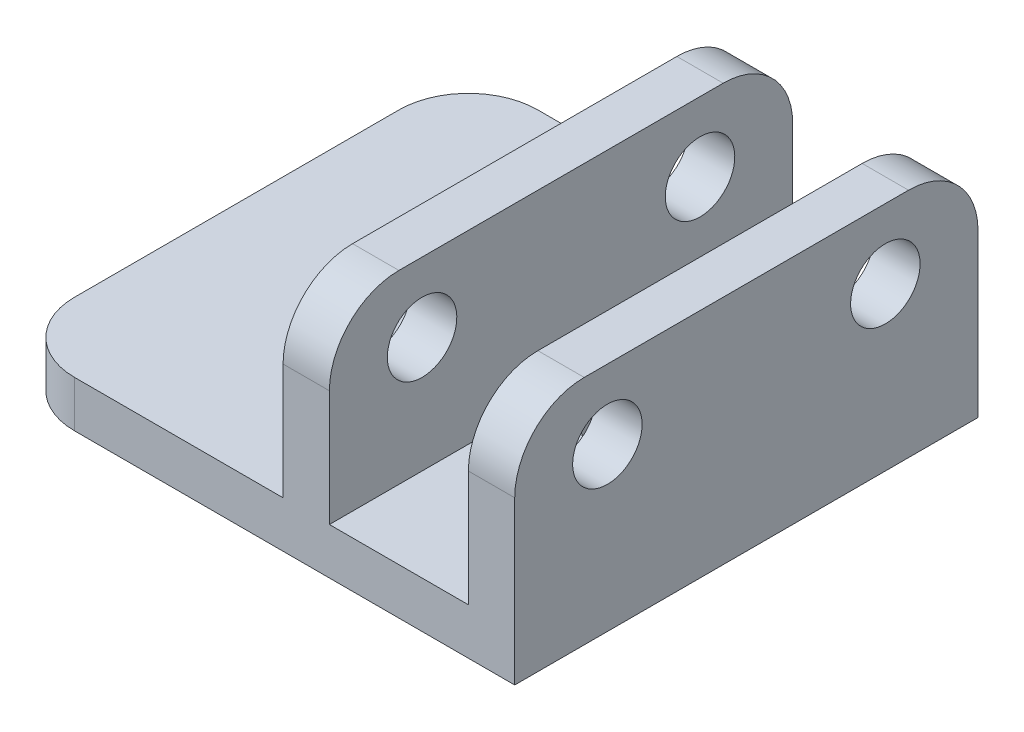
ISO-10303-21;
HEADER;
FILE_DESCRIPTION(('STEP AP214'),'2;1');
FILE_NAME('part.step','',(''),(''),'','','');
FILE_SCHEMA(('AUTOMOTIVE_DESIGN { 1 0 10303 214 1 1 1 1 }'));
ENDSEC;
DATA;
#1=APPLICATION_CONTEXT('core data for automotive mechanical design processes');
#2=APPLICATION_PROTOCOL_DEFINITION('international standard','automotive_design',2000,#1);
#3=PRODUCT_CONTEXT('',#1,'mechanical');
#4=PRODUCT('Part','Part','',(#3));
#5=PRODUCT_RELATED_PRODUCT_CATEGORY('part','',(#4));
#6=PRODUCT_DEFINITION_FORMATION('','',#4);
#7=PRODUCT_DEFINITION_CONTEXT('part definition',#1,'design');
#8=PRODUCT_DEFINITION('design','',#6,#7);
#9=PRODUCT_DEFINITION_SHAPE('','',#8);
#10=(LENGTH_UNIT() NAMED_UNIT(*) SI_UNIT(.MILLI.,.METRE.));
#11=(NAMED_UNIT(*) PLANE_ANGLE_UNIT() SI_UNIT($,.RADIAN.));
#12=(NAMED_UNIT(*) SI_UNIT($,.STERADIAN.) SOLID_ANGLE_UNIT());
#13=UNCERTAINTY_MEASURE_WITH_UNIT(LENGTH_MEASURE(1.E-05),#10,'distance_accuracy_value','');
#14=(GEOMETRIC_REPRESENTATION_CONTEXT(3) GLOBAL_UNCERTAINTY_ASSIGNED_CONTEXT((#13)) GLOBAL_UNIT_ASSIGNED_CONTEXT((#10,
#11,#12)) REPRESENTATION_CONTEXT('',''));
#15=CARTESIAN_POINT('',(0.,0.,0.));
#16=DIRECTION('',(0.,0.,1.));
#17=DIRECTION('',(1.,0.,0.));
#18=AXIS2_PLACEMENT_3D('',#15,#16,#17);
#19=CARTESIAN_POINT('',(3.,10.,20.));
#20=DIRECTION('',(1.,0.,0.));
#21=DIRECTION('',(0.,1.,0.));
#22=AXIS2_PLACEMENT_3D('',#19,#20,#21);
#23=PLANE('',#22);
#24=CARTESIAN_POINT('',(3.,7.,16.));
#25=DIRECTION('',(1.,0.,0.));
#26=DIRECTION('',(0.,1.,0.));
#27=AXIS2_PLACEMENT_3D('',#24,#25,#26);
#28=CIRCLE('',#27,1.5);
#29=CARTESIAN_POINT('',(3.,8.5,16.));
#30=VERTEX_POINT('',#29);
#31=EDGE_CURVE('E275',#30,#30,#28,.T.);
#32=ORIENTED_EDGE('',*,*,#31,.T.);
#33=EDGE_LOOP('',(#32));
#34=FACE_BOUND('',#33,.T.);
#35=CARTESIAN_POINT('',(3.,7.,4.));
#36=DIRECTION('',(1.,0.,0.));
#37=DIRECTION('',(0.,1.,0.));
#38=AXIS2_PLACEMENT_3D('',#35,#36,#37);
#39=CIRCLE('',#38,1.5);
#40=CARTESIAN_POINT('',(3.,8.5,4.));
#41=VERTEX_POINT('',#40);
#42=EDGE_CURVE('E269',#41,#41,#39,.T.);
#43=ORIENTED_EDGE('',*,*,#42,.T.);
#44=EDGE_LOOP('',(#43));
#45=FACE_BOUND('',#44,.T.);
#46=DIRECTION('',(0.,0.,-1.));
#47=VECTOR('',#46,1.);
#48=CARTESIAN_POINT('',(3.,10.,20.));
#49=LINE('',#48,#47);
#50=CARTESIAN_POINT('',(3.,10.,17.));
#51=VERTEX_POINT('',#50);
#52=CARTESIAN_POINT('',(3.,10.,3.));
#53=VERTEX_POINT('',#52);
#54=EDGE_CURVE('E303',#51,#53,#49,.T.);
#55=ORIENTED_EDGE('',*,*,#54,.T.);
#56=CARTESIAN_POINT('',(3.,7.,3.));
#57=DIRECTION('',(1.,0.,0.));
#58=DIRECTION('',(0.,1.,0.));
#59=AXIS2_PLACEMENT_3D('',#56,#57,#58);
#60=CIRCLE('',#59,3.);
#61=CARTESIAN_POINT('',(3.,7.,0.));
#62=VERTEX_POINT('',#61);
#63=EDGE_CURVE('E228',#53,#62,#60,.F.);
#64=ORIENTED_EDGE('',*,*,#63,.T.);
#65=DIRECTION('',(0.,-1.,0.));
#66=VECTOR('',#65,1.);
#67=CARTESIAN_POINT('',(3.,10.,0.));
#68=LINE('',#67,#66);
#69=CARTESIAN_POINT('',(3.,2.,0.));
#70=VERTEX_POINT('',#69);
#71=EDGE_CURVE('E181',#62,#70,#68,.T.);
#72=ORIENTED_EDGE('',*,*,#71,.T.);
#73=DIRECTION('',(0.,0.,-1.));
#74=VECTOR('',#73,1.);
#75=CARTESIAN_POINT('',(3.,2.,20.));
#76=LINE('',#75,#74);
#77=CARTESIAN_POINT('',(3.,2.,20.));
#78=VERTEX_POINT('',#77);
#79=EDGE_CURVE('E172',#78,#70,#76,.T.);
#80=ORIENTED_EDGE('',*,*,#79,.F.);
#81=DIRECTION('',(0.,-1.,0.));
#82=VECTOR('',#81,1.);
#83=CARTESIAN_POINT('',(3.,10.,20.));
#84=LINE('',#83,#82);
#85=CARTESIAN_POINT('',(3.,7.,20.));
#86=VERTEX_POINT('',#85);
#87=EDGE_CURVE('E156',#86,#78,#84,.T.);
#88=ORIENTED_EDGE('',*,*,#87,.F.);
#89=CARTESIAN_POINT('',(3.,7.,17.));
#90=DIRECTION('',(1.,0.,0.));
#91=DIRECTION('',(0.,1.,0.));
#92=AXIS2_PLACEMENT_3D('',#89,#90,#91);
#93=CIRCLE('',#92,3.);
#94=EDGE_CURVE('E225',#86,#51,#93,.F.);
#95=ORIENTED_EDGE('',*,*,#94,.T.);
#96=EDGE_LOOP('',(#55,#64,#72,#80,#88,#95));
#97=FACE_BOUND('',#96,.T.);
#98=ADVANCED_FACE('F38',(#34,#45,#97),#23,.F.);
#99=CARTESIAN_POINT('',(-3.,2.,20.));
#100=DIRECTION('',(0.,-1.,0.));
#101=DIRECTION('',(0.,0.,-1.));
#102=AXIS2_PLACEMENT_3D('',#99,#100,#101);
#103=PLANE('',#102);
#104=CARTESIAN_POINT('',(0.,2.,10.));
#105=DIRECTION('',(0.,1.,0.));
#106=DIRECTION('',(-1.,0.,0.));
#107=AXIS2_PLACEMENT_3D('',#104,#105,#106);
#108=CIRCLE('',#107,1.5);
#109=CARTESIAN_POINT('',(-1.5,2.,10.));
#110=VERTEX_POINT('',#109);
#111=EDGE_CURVE('E614',#110,#110,#108,.T.);
#112=ORIENTED_EDGE('',*,*,#111,.F.);
#113=EDGE_LOOP('',(#112));
#114=FACE_BOUND('',#113,.T.);
#115=DIRECTION('',(-1.,0.,0.));
#116=VECTOR('',#115,1.);
#117=CARTESIAN_POINT('',(-3.,2.,0.));
#118=LINE('',#117,#116);
#119=CARTESIAN_POINT('',(-3.,2.,0.));
#120=VERTEX_POINT('',#119);
#121=EDGE_CURVE('E306',#70,#120,#118,.T.);
#122=ORIENTED_EDGE('',*,*,#121,.T.);
#123=DIRECTION('',(0.,0.,-1.));
#124=VECTOR('',#123,1.);
#125=CARTESIAN_POINT('',(-3.,2.,20.));
#126=LINE('',#125,#124);
#127=CARTESIAN_POINT('',(-3.,2.,20.));
#128=VERTEX_POINT('',#127);
#129=EDGE_CURVE('E174',#128,#120,#126,.T.);
#130=ORIENTED_EDGE('',*,*,#129,.F.);
#131=DIRECTION('',(-1.,0.,0.));
#132=VECTOR('',#131,1.);
#133=CARTESIAN_POINT('',(-3.,2.,20.));
#134=LINE('',#133,#132);
#135=EDGE_CURVE('E160',#78,#128,#134,.T.);
#136=ORIENTED_EDGE('',*,*,#135,.F.);
#137=ORIENTED_EDGE('',*,*,#79,.T.);
#138=EDGE_LOOP('',(#122,#130,#136,#137));
#139=FACE_BOUND('',#138,.T.);
#140=ADVANCED_FACE('F171',(#114,#139),#103,.F.);
#141=CARTESIAN_POINT('',(-3.,10.,20.));
#142=DIRECTION('',(-1.,0.,0.));
#143=DIRECTION('',(0.,-1.,0.));
#144=AXIS2_PLACEMENT_3D('',#141,#142,#143);
#145=PLANE('',#144);
#146=CARTESIAN_POINT('',(-3.,7.,16.));
#147=DIRECTION('',(-1.,0.,0.));
#148=DIRECTION('',(0.,-1.,0.));
#149=AXIS2_PLACEMENT_3D('',#146,#147,#148);
#150=CIRCLE('',#149,1.5);
#151=CARTESIAN_POINT('',(-3.,5.5,16.));
#152=VERTEX_POINT('',#151);
#153=EDGE_CURVE('E268',#152,#152,#150,.T.);
#154=ORIENTED_EDGE('',*,*,#153,.T.);
#155=EDGE_LOOP('',(#154));
#156=FACE_BOUND('',#155,.T.);
#157=CARTESIAN_POINT('',(-3.,7.,4.));
#158=DIRECTION('',(-1.,0.,0.));
#159=DIRECTION('',(0.,-1.,0.));
#160=AXIS2_PLACEMENT_3D('',#157,#158,#159);
#161=CIRCLE('',#160,1.5);
#162=CARTESIAN_POINT('',(-3.,5.5,4.));
#163=VERTEX_POINT('',#162);
#164=EDGE_CURVE('E263',#163,#163,#161,.T.);
#165=ORIENTED_EDGE('',*,*,#164,.T.);
#166=EDGE_LOOP('',(#165));
#167=FACE_BOUND('',#166,.T.);
#168=DIRECTION('',(0.,1.,0.));
#169=VECTOR('',#168,1.);
#170=CARTESIAN_POINT('',(-3.,10.,0.));
#171=LINE('',#170,#169);
#172=CARTESIAN_POINT('',(-3.,7.,0.));
#173=VERTEX_POINT('',#172);
#174=EDGE_CURVE('E309',#120,#173,#171,.T.);
#175=ORIENTED_EDGE('',*,*,#174,.T.);
#176=CARTESIAN_POINT('',(-3.,7.,3.));
#177=DIRECTION('',(-1.,0.,0.));
#178=DIRECTION('',(0.,-1.,0.));
#179=AXIS2_PLACEMENT_3D('',#176,#177,#178);
#180=CIRCLE('',#179,3.);
#181=CARTESIAN_POINT('',(-3.,10.,3.));
#182=VERTEX_POINT('',#181);
#183=EDGE_CURVE('E215',#173,#182,#180,.F.);
#184=ORIENTED_EDGE('',*,*,#183,.T.);
#185=DIRECTION('',(0.,0.,-1.));
#186=VECTOR('',#185,1.);
#187=CARTESIAN_POINT('',(-3.,10.,20.));
#188=LINE('',#187,#186);
#189=CARTESIAN_POINT('',(-3.,10.,17.));
#190=VERTEX_POINT('',#189);
#191=EDGE_CURVE('E190',#190,#182,#188,.T.);
#192=ORIENTED_EDGE('',*,*,#191,.F.);
#193=CARTESIAN_POINT('',(-3.,7.,17.));
#194=DIRECTION('',(-1.,0.,0.));
#195=DIRECTION('',(0.,-1.,0.));
#196=AXIS2_PLACEMENT_3D('',#193,#194,#195);
#197=CIRCLE('',#196,3.);
#198=CARTESIAN_POINT('',(-3.,7.,20.));
#199=VERTEX_POINT('',#198);
#200=EDGE_CURVE('E212',#190,#199,#197,.F.);
#201=ORIENTED_EDGE('',*,*,#200,.T.);
#202=DIRECTION('',(0.,1.,0.));
#203=VECTOR('',#202,1.);
#204=CARTESIAN_POINT('',(-3.,10.,20.));
#205=LINE('',#204,#203);
#206=EDGE_CURVE('E177',#128,#199,#205,.T.);
#207=ORIENTED_EDGE('',*,*,#206,.F.);
#208=ORIENTED_EDGE('',*,*,#129,.T.);
#209=EDGE_LOOP('',(#175,#184,#192,#201,#207,#208));
#210=FACE_BOUND('',#209,.T.);
#211=ADVANCED_FACE('F407',(#156,#167,#210),#145,.F.);
#212=CARTESIAN_POINT('',(-5.,10.,20.));
#213=DIRECTION('',(0.,-1.,0.));
#214=DIRECTION('',(0.,0.,-1.));
#215=AXIS2_PLACEMENT_3D('',#212,#213,#214);
#216=PLANE('',#215);
#217=ORIENTED_EDGE('',*,*,#191,.T.);
#218=DIRECTION('',(-1.,0.,0.));
#219=VECTOR('',#218,1.);
#220=CARTESIAN_POINT('',(-5.,10.,3.));
#221=LINE('',#220,#219);
#222=CARTESIAN_POINT('',(-5.,10.,3.));
#223=VERTEX_POINT('',#222);
#224=EDGE_CURVE('E188',#182,#223,#221,.T.);
#225=ORIENTED_EDGE('',*,*,#224,.T.);
#226=DIRECTION('',(0.,0.,-1.));
#227=VECTOR('',#226,1.);
#228=CARTESIAN_POINT('',(-5.,10.,20.));
#229=LINE('',#228,#227);
#230=CARTESIAN_POINT('',(-5.,10.,17.));
#231=VERTEX_POINT('',#230);
#232=EDGE_CURVE('E348',#231,#223,#229,.T.);
#233=ORIENTED_EDGE('',*,*,#232,.F.);
#234=DIRECTION('',(-1.,0.,0.));
#235=VECTOR('',#234,1.);
#236=CARTESIAN_POINT('',(-3.,10.,17.));
#237=LINE('',#236,#235);
#238=EDGE_CURVE('E184',#231,#190,#237,.F.);
#239=ORIENTED_EDGE('',*,*,#238,.T.);
#240=EDGE_LOOP('',(#217,#225,#233,#239));
#241=FACE_BOUND('',#240,.T.);
#242=ADVANCED_FACE('F356',(#241),#216,.F.);
#243=CARTESIAN_POINT('',(-5.,2.,20.));
#244=DIRECTION('',(1.,0.,0.));
#245=DIRECTION('',(0.,0.,-1.));
#246=AXIS2_PLACEMENT_3D('',#243,#244,#245);
#247=PLANE('',#246);
#248=CARTESIAN_POINT('',(-5.,7.,16.));
#249=DIRECTION('',(-1.,0.,0.));
#250=DIRECTION('',(0.,0.,1.));
#251=AXIS2_PLACEMENT_3D('',#248,#249,#250);
#252=CIRCLE('',#251,1.5);
#253=CARTESIAN_POINT('',(-5.,7.,17.5));
#254=VERTEX_POINT('',#253);
#255=EDGE_CURVE('E264',#254,#254,#252,.T.);
#256=ORIENTED_EDGE('',*,*,#255,.F.);
#257=EDGE_LOOP('',(#256));
#258=FACE_BOUND('',#257,.T.);
#259=CARTESIAN_POINT('',(-5.,7.,4.));
#260=DIRECTION('',(-1.,0.,0.));
#261=DIRECTION('',(0.,0.,-1.));
#262=AXIS2_PLACEMENT_3D('',#259,#260,#261);
#263=CIRCLE('',#262,1.5);
#264=CARTESIAN_POINT('',(-5.,7.,2.5));
#265=VERTEX_POINT('',#264);
#266=EDGE_CURVE('E460',#265,#265,#263,.T.);
#267=ORIENTED_EDGE('',*,*,#266,.F.);
#268=EDGE_LOOP('',(#267));
#269=FACE_BOUND('',#268,.T.);
#270=ORIENTED_EDGE('',*,*,#232,.T.);
#271=CARTESIAN_POINT('',(-5.,7.,3.));
#272=DIRECTION('',(1.,0.,0.));
#273=DIRECTION('',(0.,0.,-1.));
#274=AXIS2_PLACEMENT_3D('',#271,#272,#273);
#275=CIRCLE('',#274,3.);
#276=CARTESIAN_POINT('',(-5.,7.,0.));
#277=VERTEX_POINT('',#276);
#278=EDGE_CURVE('E200',#223,#277,#275,.F.);
#279=ORIENTED_EDGE('',*,*,#278,.T.);
#280=DIRECTION('',(0.,-1.,0.));
#281=VECTOR('',#280,1.);
#282=CARTESIAN_POINT('',(-5.,2.,0.));
#283=LINE('',#282,#281);
#284=CARTESIAN_POINT('',(-5.,2.,0.));
#285=VERTEX_POINT('',#284);
#286=EDGE_CURVE('E313',#277,#285,#283,.T.);
#287=ORIENTED_EDGE('',*,*,#286,.T.);
#288=DIRECTION('',(0.,0.,-1.));
#289=VECTOR('',#288,1.);
#290=CARTESIAN_POINT('',(-5.,2.,20.));
#291=LINE('',#290,#289);
#292=CARTESIAN_POINT('',(-5.,2.,20.));
#293=VERTEX_POINT('',#292);
#294=EDGE_CURVE('E344',#293,#285,#291,.T.);
#295=ORIENTED_EDGE('',*,*,#294,.F.);
#296=DIRECTION('',(0.,-1.,0.));
#297=VECTOR('',#296,1.);
#298=CARTESIAN_POINT('',(-5.,2.,20.));
#299=LINE('',#298,#297);
#300=CARTESIAN_POINT('',(-5.,7.,20.));
#301=VERTEX_POINT('',#300);
#302=EDGE_CURVE('E291',#301,#293,#299,.T.);
#303=ORIENTED_EDGE('',*,*,#302,.F.);
#304=CARTESIAN_POINT('',(-5.,7.,17.));
#305=DIRECTION('',(1.,0.,0.));
#306=DIRECTION('',(0.,0.,-1.));
#307=AXIS2_PLACEMENT_3D('',#304,#305,#306);
#308=CIRCLE('',#307,3.);
#309=EDGE_CURVE('E197',#301,#231,#308,.F.);
#310=ORIENTED_EDGE('',*,*,#309,.T.);
#311=EDGE_LOOP('',(#270,#279,#287,#295,#303,#310));
#312=FACE_BOUND('',#311,.T.);
#313=ADVANCED_FACE('F367',(#258,#269,#312),#247,.F.);
#314=CARTESIAN_POINT('',(-17.,2.,20.));
#315=DIRECTION('',(0.,-1.,0.));
#316=DIRECTION('',(1.,0.,0.));
#317=AXIS2_PLACEMENT_3D('',#314,#315,#316);
#318=PLANE('',#317);
#319=DIRECTION('',(-1.,0.,0.));
#320=VECTOR('',#319,1.);
#321=CARTESIAN_POINT('',(-17.,2.,0.));
#322=LINE('',#321,#320);
#323=CARTESIAN_POINT('',(-14.,2.,0.));
#324=VERTEX_POINT('',#323);
#325=EDGE_CURVE('E316',#285,#324,#322,.T.);
#326=ORIENTED_EDGE('',*,*,#325,.T.);
#327=CARTESIAN_POINT('',(-14.,2.,3.));
#328=DIRECTION('',(0.,-1.,0.));
#329=DIRECTION('',(1.,0.,0.));
#330=AXIS2_PLACEMENT_3D('',#327,#328,#329);
#331=CIRCLE('',#330,3.);
#332=CARTESIAN_POINT('',(-17.,2.,3.));
#333=VERTEX_POINT('',#332);
#334=EDGE_CURVE('E251',#324,#333,#331,.F.);
#335=ORIENTED_EDGE('',*,*,#334,.T.);
#336=DIRECTION('',(0.,0.,-1.));
#337=VECTOR('',#336,1.);
#338=CARTESIAN_POINT('',(-17.,2.,20.));
#339=LINE('',#338,#337);
#340=CARTESIAN_POINT('',(-17.,2.,17.));
#341=VERTEX_POINT('',#340);
#342=EDGE_CURVE('E340',#341,#333,#339,.T.);
#343=ORIENTED_EDGE('',*,*,#342,.F.);
#344=CARTESIAN_POINT('',(-14.,2.,17.));
#345=DIRECTION('',(0.,-1.,0.));
#346=DIRECTION('',(1.,0.,0.));
#347=AXIS2_PLACEMENT_3D('',#344,#345,#346);
#348=CIRCLE('',#347,3.);
#349=CARTESIAN_POINT('',(-14.,2.,20.));
#350=VERTEX_POINT('',#349);
#351=EDGE_CURVE('E56',#341,#350,#348,.F.);
#352=ORIENTED_EDGE('',*,*,#351,.T.);
#353=DIRECTION('',(-1.,0.,0.));
#354=VECTOR('',#353,1.);
#355=CARTESIAN_POINT('',(-17.,2.,20.));
#356=LINE('',#355,#354);
#357=EDGE_CURVE('E294',#293,#350,#356,.T.);
#358=ORIENTED_EDGE('',*,*,#357,.F.);
#359=ORIENTED_EDGE('',*,*,#294,.T.);
#360=EDGE_LOOP('',(#326,#335,#343,#352,#358,#359));
#361=FACE_BOUND('',#360,.T.);
#362=ADVANCED_FACE('F376',(#361),#318,.F.);
#363=CARTESIAN_POINT('',(-17.,0.,20.));
#364=DIRECTION('',(1.,0.,0.));
#365=DIRECTION('',(0.,0.,-1.));
#366=AXIS2_PLACEMENT_3D('',#363,#364,#365);
#367=PLANE('',#366);
#368=ORIENTED_EDGE('',*,*,#342,.T.);
#369=DIRECTION('',(0.,-1.,0.));
#370=VECTOR('',#369,1.);
#371=CARTESIAN_POINT('',(-17.,0.,3.));
#372=LINE('',#371,#370);
#373=CARTESIAN_POINT('',(-17.,0.,3.));
#374=VERTEX_POINT('',#373);
#375=EDGE_CURVE('E240',#333,#374,#372,.T.);
#376=ORIENTED_EDGE('',*,*,#375,.T.);
#377=DIRECTION('',(0.,0.,-1.));
#378=VECTOR('',#377,1.);
#379=CARTESIAN_POINT('',(-17.,0.,20.));
#380=LINE('',#379,#378);
#381=CARTESIAN_POINT('',(-17.,0.,17.));
#382=VERTEX_POINT('',#381);
#383=EDGE_CURVE('E336',#382,#374,#380,.T.);
#384=ORIENTED_EDGE('',*,*,#383,.F.);
#385=DIRECTION('',(0.,-1.,0.));
#386=VECTOR('',#385,1.);
#387=CARTESIAN_POINT('',(-17.,2.,17.));
#388=LINE('',#387,#386);
#389=EDGE_CURVE('E237',#382,#341,#388,.F.);
#390=ORIENTED_EDGE('',*,*,#389,.T.);
#391=EDGE_LOOP('',(#368,#376,#384,#390));
#392=FACE_BOUND('',#391,.T.);
#393=ADVANCED_FACE('F382',(#392),#367,.F.);
#394=CARTESIAN_POINT('',(5.,0.,20.));
#395=DIRECTION('',(0.,1.,0.));
#396=DIRECTION('',(-1.,0.,0.));
#397=AXIS2_PLACEMENT_3D('',#394,#395,#396);
#398=PLANE('',#397);
#399=CARTESIAN_POINT('',(0.,0.,10.));
#400=DIRECTION('',(0.,1.,0.));
#401=DIRECTION('',(-1.,0.,0.));
#402=AXIS2_PLACEMENT_3D('',#399,#400,#401);
#403=CIRCLE('',#402,1.5);
#404=CARTESIAN_POINT('',(-1.5,0.,10.));
#405=VERTEX_POINT('',#404);
#406=EDGE_CURVE('E42',#405,#405,#403,.T.);
#407=ORIENTED_EDGE('',*,*,#406,.T.);
#408=EDGE_LOOP('',(#407));
#409=FACE_BOUND('',#408,.T.);
#410=ORIENTED_EDGE('',*,*,#383,.T.);
#411=CARTESIAN_POINT('',(-14.,0.,3.));
#412=DIRECTION('',(0.,1.,0.));
#413=DIRECTION('',(-1.,0.,0.));
#414=AXIS2_PLACEMENT_3D('',#411,#412,#413);
#415=CIRCLE('',#414,3.);
#416=CARTESIAN_POINT('',(-14.,0.,0.));
#417=VERTEX_POINT('',#416);
#418=EDGE_CURVE('E246',#374,#417,#415,.F.);
#419=ORIENTED_EDGE('',*,*,#418,.T.);
#420=DIRECTION('',(1.,0.,0.));
#421=VECTOR('',#420,1.);
#422=CARTESIAN_POINT('',(5.,0.,0.));
#423=LINE('',#422,#421);
#424=CARTESIAN_POINT('',(5.,0.,0.));
#425=VERTEX_POINT('',#424);
#426=EDGE_CURVE('E320',#417,#425,#423,.T.);
#427=ORIENTED_EDGE('',*,*,#426,.T.);
#428=DIRECTION('',(0.,0.,-1.));
#429=VECTOR('',#428,1.);
#430=CARTESIAN_POINT('',(5.,0.,20.));
#431=LINE('',#430,#429);
#432=CARTESIAN_POINT('',(5.,0.,20.));
#433=VERTEX_POINT('',#432);
#434=EDGE_CURVE('E332',#433,#425,#431,.T.);
#435=ORIENTED_EDGE('',*,*,#434,.F.);
#436=DIRECTION('',(1.,0.,0.));
#437=VECTOR('',#436,1.);
#438=CARTESIAN_POINT('',(5.,0.,20.));
#439=LINE('',#438,#437);
#440=CARTESIAN_POINT('',(-14.,0.,20.));
#441=VERTEX_POINT('',#440);
#442=EDGE_CURVE('E297',#441,#433,#439,.T.);
#443=ORIENTED_EDGE('',*,*,#442,.F.);
#444=CARTESIAN_POINT('',(-14.,0.,17.));
#445=DIRECTION('',(0.,1.,0.));
#446=DIRECTION('',(-1.,0.,0.));
#447=AXIS2_PLACEMENT_3D('',#444,#445,#446);
#448=CIRCLE('',#447,3.);
#449=EDGE_CURVE('E64',#441,#382,#448,.F.);
#450=ORIENTED_EDGE('',*,*,#449,.T.);
#451=EDGE_LOOP('',(#410,#419,#427,#435,#443,#450));
#452=FACE_BOUND('',#451,.T.);
#453=ADVANCED_FACE('F384',(#409,#452),#398,.F.);
#454=CARTESIAN_POINT('',(5.,10.,20.));
#455=DIRECTION('',(-1.,0.,0.));
#456=DIRECTION('',(0.,-1.,0.));
#457=AXIS2_PLACEMENT_3D('',#454,#455,#456);
#458=PLANE('',#457);
#459=CARTESIAN_POINT('',(5.,7.,16.));
#460=DIRECTION('',(-1.,0.,0.));
#461=DIRECTION('',(0.,-1.,0.));
#462=AXIS2_PLACEMENT_3D('',#459,#460,#461);
#463=CIRCLE('',#462,1.5);
#464=CARTESIAN_POINT('',(5.,5.5,16.));
#465=VERTEX_POINT('',#464);
#466=EDGE_CURVE('E265',#465,#465,#463,.T.);
#467=ORIENTED_EDGE('',*,*,#466,.T.);
#468=EDGE_LOOP('',(#467));
#469=FACE_BOUND('',#468,.T.);
#470=CARTESIAN_POINT('',(5.,7.,4.));
#471=DIRECTION('',(-1.,0.,0.));
#472=DIRECTION('',(0.,-1.,0.));
#473=AXIS2_PLACEMENT_3D('',#470,#471,#472);
#474=CIRCLE('',#473,1.5);
#475=CARTESIAN_POINT('',(5.,5.5,4.));
#476=VERTEX_POINT('',#475);
#477=EDGE_CURVE('E260',#476,#476,#474,.T.);
#478=ORIENTED_EDGE('',*,*,#477,.T.);
#479=EDGE_LOOP('',(#478));
#480=FACE_BOUND('',#479,.T.);
#481=DIRECTION('',(0.,1.,0.));
#482=VECTOR('',#481,1.);
#483=CARTESIAN_POINT('',(5.,10.,0.));
#484=LINE('',#483,#482);
#485=CARTESIAN_POINT('',(5.,7.,0.));
#486=VERTEX_POINT('',#485);
#487=EDGE_CURVE('E167',#425,#486,#484,.T.);
#488=ORIENTED_EDGE('',*,*,#487,.T.);
#489=CARTESIAN_POINT('',(5.,7.,3.));
#490=DIRECTION('',(-1.,0.,0.));
#491=DIRECTION('',(0.,-1.,0.));
#492=AXIS2_PLACEMENT_3D('',#489,#490,#491);
#493=CIRCLE('',#492,3.);
#494=CARTESIAN_POINT('',(5.,10.,3.));
#495=VERTEX_POINT('',#494);
#496=EDGE_CURVE('E234',#486,#495,#493,.F.);
#497=ORIENTED_EDGE('',*,*,#496,.T.);
#498=DIRECTION('',(0.,0.,-1.));
#499=VECTOR('',#498,1.);
#500=CARTESIAN_POINT('',(5.,10.,20.));
#501=LINE('',#500,#499);
#502=CARTESIAN_POINT('',(5.,10.,17.));
#503=VERTEX_POINT('',#502);
#504=EDGE_CURVE('E328',#503,#495,#501,.T.);
#505=ORIENTED_EDGE('',*,*,#504,.F.);
#506=CARTESIAN_POINT('',(5.,7.,17.));
#507=DIRECTION('',(-1.,0.,0.));
#508=DIRECTION('',(0.,-1.,0.));
#509=AXIS2_PLACEMENT_3D('',#506,#507,#508);
#510=CIRCLE('',#509,3.);
#511=CARTESIAN_POINT('',(5.,7.,20.));
#512=VERTEX_POINT('',#511);
#513=EDGE_CURVE('E231',#503,#512,#510,.F.);
#514=ORIENTED_EDGE('',*,*,#513,.T.);
#515=DIRECTION('',(0.,1.,0.));
#516=VECTOR('',#515,1.);
#517=CARTESIAN_POINT('',(5.,10.,20.));
#518=LINE('',#517,#516);
#519=EDGE_CURVE('E300',#433,#512,#518,.T.);
#520=ORIENTED_EDGE('',*,*,#519,.F.);
#521=ORIENTED_EDGE('',*,*,#434,.T.);
#522=EDGE_LOOP('',(#488,#497,#505,#514,#520,#521));
#523=FACE_BOUND('',#522,.T.);
#524=ADVANCED_FACE('F423',(#469,#480,#523),#458,.F.);
#525=CARTESIAN_POINT('',(5.,10.,20.));
#526=DIRECTION('',(0.,-1.,0.));
#527=DIRECTION('',(0.,0.,-1.));
#528=AXIS2_PLACEMENT_3D('',#525,#526,#527);
#529=PLANE('',#528);
#530=ORIENTED_EDGE('',*,*,#504,.T.);
#531=DIRECTION('',(-1.,0.,0.));
#532=VECTOR('',#531,1.);
#533=CARTESIAN_POINT('',(5.,10.,3.));
#534=LINE('',#533,#532);
#535=EDGE_CURVE('E221',#495,#53,#534,.T.);
#536=ORIENTED_EDGE('',*,*,#535,.T.);
#537=ORIENTED_EDGE('',*,*,#54,.F.);
#538=DIRECTION('',(-1.,0.,0.));
#539=VECTOR('',#538,1.);
#540=CARTESIAN_POINT('',(5.,10.,17.));
#541=LINE('',#540,#539);
#542=EDGE_CURVE('E218',#51,#503,#541,.F.);
#543=ORIENTED_EDGE('',*,*,#542,.T.);
#544=EDGE_LOOP('',(#530,#536,#537,#543));
#545=FACE_BOUND('',#544,.T.);
#546=ADVANCED_FACE('F427',(#545),#529,.F.);
#547=CARTESIAN_POINT('',(0.,0.,20.));
#548=DIRECTION('',(0.,0.,1.));
#549=DIRECTION('',(1.,0.,0.));
#550=AXIS2_PLACEMENT_3D('',#547,#548,#549);
#551=PLANE('',#550);
#552=ORIENTED_EDGE('',*,*,#357,.T.);
#553=DIRECTION('',(0.,-1.,0.));
#554=VECTOR('',#553,1.);
#555=CARTESIAN_POINT('',(-14.,0.,20.));
#556=LINE('',#555,#554);
#557=EDGE_CURVE('E11',#350,#441,#556,.T.);
#558=ORIENTED_EDGE('',*,*,#557,.T.);
#559=ORIENTED_EDGE('',*,*,#442,.T.);
#560=ORIENTED_EDGE('',*,*,#519,.T.);
#561=DIRECTION('',(-1.,0.,0.));
#562=VECTOR('',#561,1.);
#563=CARTESIAN_POINT('',(3.,7.,20.));
#564=LINE('',#563,#562);
#565=EDGE_CURVE('E48',#512,#86,#564,.T.);
#566=ORIENTED_EDGE('',*,*,#565,.T.);
#567=ORIENTED_EDGE('',*,*,#87,.T.);
#568=ORIENTED_EDGE('',*,*,#135,.T.);
#569=ORIENTED_EDGE('',*,*,#206,.T.);
#570=DIRECTION('',(-1.,0.,0.));
#571=VECTOR('',#570,1.);
#572=CARTESIAN_POINT('',(-5.,7.,20.));
#573=LINE('',#572,#571);
#574=EDGE_CURVE('E254',#199,#301,#573,.T.);
#575=ORIENTED_EDGE('',*,*,#574,.T.);
#576=ORIENTED_EDGE('',*,*,#302,.T.);
#577=EDGE_LOOP('',(#552,#558,#559,#560,#566,#567,#568,#569,#575,#576));
#578=FACE_BOUND('',#577,.T.);
#579=ADVANCED_FACE('F158',(#578),#551,.T.);
#580=CARTESIAN_POINT('',(0.,0.,0.));
#581=DIRECTION('',(0.,0.,1.));
#582=DIRECTION('',(1.,0.,0.));
#583=AXIS2_PLACEMENT_3D('',#580,#581,#582);
#584=PLANE('',#583);
#585=ORIENTED_EDGE('',*,*,#286,.F.);
#586=DIRECTION('',(-1.,0.,0.));
#587=VECTOR('',#586,1.);
#588=CARTESIAN_POINT('',(0.,7.,0.));
#589=LINE('',#588,#587);
#590=EDGE_CURVE('E209',#277,#173,#589,.F.);
#591=ORIENTED_EDGE('',*,*,#590,.T.);
#592=ORIENTED_EDGE('',*,*,#174,.F.);
#593=ORIENTED_EDGE('',*,*,#121,.F.);
#594=ORIENTED_EDGE('',*,*,#71,.F.);
#595=DIRECTION('',(-1.,0.,0.));
#596=VECTOR('',#595,1.);
#597=CARTESIAN_POINT('',(0.,7.,0.));
#598=LINE('',#597,#596);
#599=EDGE_CURVE('E206',#62,#486,#598,.F.);
#600=ORIENTED_EDGE('',*,*,#599,.T.);
#601=ORIENTED_EDGE('',*,*,#487,.F.);
#602=ORIENTED_EDGE('',*,*,#426,.F.);
#603=DIRECTION('',(0.,-1.,0.));
#604=VECTOR('',#603,1.);
#605=CARTESIAN_POINT('',(-14.,0.,0.));
#606=LINE('',#605,#604);
#607=EDGE_CURVE('E203',#417,#324,#606,.F.);
#608=ORIENTED_EDGE('',*,*,#607,.T.);
#609=ORIENTED_EDGE('',*,*,#325,.F.);
#610=EDGE_LOOP('',(#585,#591,#592,#593,#594,#600,#601,#602,#608,#609));
#611=FACE_BOUND('',#610,.T.);
#612=ADVANCED_FACE('F371',(#611),#584,.F.);
#613=CARTESIAN_POINT('',(-5.,7.,3.));
#614=DIRECTION('',(-1.,0.,0.));
#615=DIRECTION('',(0.,0.,1.));
#616=AXIS2_PLACEMENT_3D('',#613,#614,#615);
#617=CYLINDRICAL_SURFACE('',#616,3.);
#618=ORIENTED_EDGE('',*,*,#183,.F.);
#619=ORIENTED_EDGE('',*,*,#590,.F.);
#620=ORIENTED_EDGE('',*,*,#278,.F.);
#621=ORIENTED_EDGE('',*,*,#224,.F.);
#622=EDGE_LOOP('',(#618,#619,#620,#621));
#623=FACE_BOUND('',#622,.T.);
#624=ADVANCED_FACE('F363',(#623),#617,.T.);
#625=CARTESIAN_POINT('',(5.,7.,3.));
#626=DIRECTION('',(-1.,0.,0.));
#627=DIRECTION('',(0.,0.,1.));
#628=AXIS2_PLACEMENT_3D('',#625,#626,#627);
#629=CYLINDRICAL_SURFACE('',#628,3.);
#630=ORIENTED_EDGE('',*,*,#496,.F.);
#631=ORIENTED_EDGE('',*,*,#599,.F.);
#632=ORIENTED_EDGE('',*,*,#63,.F.);
#633=ORIENTED_EDGE('',*,*,#535,.F.);
#634=EDGE_LOOP('',(#630,#631,#632,#633));
#635=FACE_BOUND('',#634,.T.);
#636=ADVANCED_FACE('F397',(#635),#629,.T.);
#637=CARTESIAN_POINT('',(-14.,0.,3.));
#638=DIRECTION('',(0.,-1.,0.));
#639=DIRECTION('',(0.,0.,-1.));
#640=AXIS2_PLACEMENT_3D('',#637,#638,#639);
#641=CYLINDRICAL_SURFACE('',#640,3.);
#642=ORIENTED_EDGE('',*,*,#334,.F.);
#643=ORIENTED_EDGE('',*,*,#607,.F.);
#644=ORIENTED_EDGE('',*,*,#418,.F.);
#645=ORIENTED_EDGE('',*,*,#375,.F.);
#646=EDGE_LOOP('',(#642,#643,#644,#645));
#647=FACE_BOUND('',#646,.T.);
#648=ADVANCED_FACE('F379',(#647),#641,.T.);
#649=CARTESIAN_POINT('',(-14.,0.,17.));
#650=DIRECTION('',(0.,1.,0.));
#651=DIRECTION('',(0.,0.,1.));
#652=AXIS2_PLACEMENT_3D('',#649,#650,#651);
#653=CYLINDRICAL_SURFACE('',#652,3.);
#654=ORIENTED_EDGE('',*,*,#351,.F.);
#655=ORIENTED_EDGE('',*,*,#389,.F.);
#656=ORIENTED_EDGE('',*,*,#449,.F.);
#657=ORIENTED_EDGE('',*,*,#557,.F.);
#658=EDGE_LOOP('',(#654,#655,#656,#657));
#659=FACE_BOUND('',#658,.T.);
#660=ADVANCED_FACE('F388',(#659),#653,.T.);
#661=CARTESIAN_POINT('',(0.,7.,17.));
#662=DIRECTION('',(1.,0.,0.));
#663=DIRECTION('',(0.,0.,-1.));
#664=AXIS2_PLACEMENT_3D('',#661,#662,#663);
#665=CYLINDRICAL_SURFACE('',#664,3.);
#666=ORIENTED_EDGE('',*,*,#513,.F.);
#667=ORIENTED_EDGE('',*,*,#542,.F.);
#668=ORIENTED_EDGE('',*,*,#94,.F.);
#669=ORIENTED_EDGE('',*,*,#565,.F.);
#670=EDGE_LOOP('',(#666,#667,#668,#669));
#671=FACE_BOUND('',#670,.T.);
#672=ADVANCED_FACE('F390',(#671),#665,.T.);
#673=CARTESIAN_POINT('',(0.,7.,17.));
#674=DIRECTION('',(1.,0.,0.));
#675=DIRECTION('',(0.,0.,-1.));
#676=AXIS2_PLACEMENT_3D('',#673,#674,#675);
#677=CYLINDRICAL_SURFACE('',#676,3.);
#678=ORIENTED_EDGE('',*,*,#200,.F.);
#679=ORIENTED_EDGE('',*,*,#238,.F.);
#680=ORIENTED_EDGE('',*,*,#309,.F.);
#681=ORIENTED_EDGE('',*,*,#574,.F.);
#682=EDGE_LOOP('',(#678,#679,#680,#681));
#683=FACE_BOUND('',#682,.T.);
#684=ADVANCED_FACE('F40',(#683),#677,.T.);
#685=CARTESIAN_POINT('',(15.,7.,4.));
#686=DIRECTION('',(-1.,0.,0.));
#687=DIRECTION('',(0.,0.,1.));
#688=AXIS2_PLACEMENT_3D('',#685,#686,#687);
#689=CYLINDRICAL_SURFACE('',#688,1.5);
#690=ORIENTED_EDGE('',*,*,#477,.F.);
#691=EDGE_LOOP('',(#690));
#692=FACE_BOUND('',#691,.T.);
#693=ORIENTED_EDGE('',*,*,#42,.F.);
#694=EDGE_LOOP('',(#693));
#695=FACE_BOUND('',#694,.T.);
#696=ADVANCED_FACE('F434',(#692,#695),#689,.F.);
#697=CARTESIAN_POINT('',(15.,7.,16.));
#698=DIRECTION('',(-1.,0.,0.));
#699=DIRECTION('',(0.,0.,1.));
#700=AXIS2_PLACEMENT_3D('',#697,#698,#699);
#701=CYLINDRICAL_SURFACE('',#700,1.5);
#702=ORIENTED_EDGE('',*,*,#466,.F.);
#703=EDGE_LOOP('',(#702));
#704=FACE_BOUND('',#703,.T.);
#705=ORIENTED_EDGE('',*,*,#31,.F.);
#706=EDGE_LOOP('',(#705));
#707=FACE_BOUND('',#706,.T.);
#708=ADVANCED_FACE('F437',(#704,#707),#701,.F.);
#709=ORIENTED_EDGE('',*,*,#266,.T.);
#710=EDGE_LOOP('',(#709));
#711=FACE_BOUND('',#710,.T.);
#712=ORIENTED_EDGE('',*,*,#164,.F.);
#713=EDGE_LOOP('',(#712));
#714=FACE_BOUND('',#713,.T.);
#715=ADVANCED_FACE('F440',(#711,#714),#689,.F.);
#716=ORIENTED_EDGE('',*,*,#255,.T.);
#717=EDGE_LOOP('',(#716));
#718=FACE_BOUND('',#717,.T.);
#719=ORIENTED_EDGE('',*,*,#153,.F.);
#720=EDGE_LOOP('',(#719));
#721=FACE_BOUND('',#720,.T.);
#722=ADVANCED_FACE('F446',(#718,#721),#701,.F.);
#723=CARTESIAN_POINT('',(0.,-18.,10.));
#724=DIRECTION('',(0.,1.,0.));
#725=DIRECTION('',(-1.,0.,0.));
#726=AXIS2_PLACEMENT_3D('',#723,#724,#725);
#727=CYLINDRICAL_SURFACE('',#726,1.5);
#728=ORIENTED_EDGE('',*,*,#111,.T.);
#729=EDGE_LOOP('',(#728));
#730=FACE_BOUND('',#729,.T.);
#731=ORIENTED_EDGE('',*,*,#406,.F.);
#732=EDGE_LOOP('',(#731));
#733=FACE_BOUND('',#732,.T.);
#734=ADVANCED_FACE('F455',(#730,#733),#727,.F.);
#735=CLOSED_SHELL('',(#98,#140,#211,#242,#313,#362,#393,#453,#524,#546,#579,#612,#624,#636,#648,
#660,#672,#684,#696,#708,#715,#722,#734));
#736=MANIFOLD_SOLID_BREP('B2',#735);
#737=ADVANCED_BREP_SHAPE_REPRESENTATION('',(#18,#736),#14);
#738=SHAPE_DEFINITION_REPRESENTATION(#9,#737);
ENDSEC;
END-ISO-10303-21;
